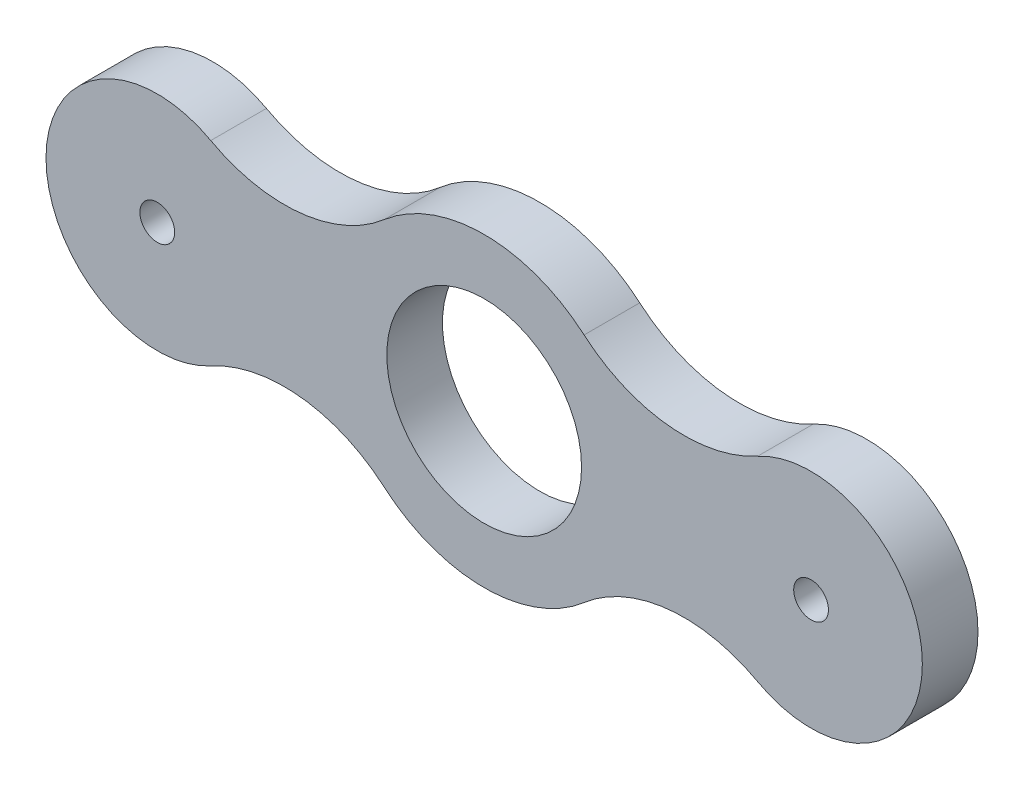
ISO-10303-21;
HEADER;
FILE_DESCRIPTION(('STEP AP214'),'2;1');
FILE_NAME('part.step','',(''),(''),'','','');
FILE_SCHEMA(('AUTOMOTIVE_DESIGN { 1 0 10303 214 1 1 1 1 }'));
ENDSEC;
DATA;
#1=APPLICATION_CONTEXT('core data for automotive mechanical design processes');
#2=APPLICATION_PROTOCOL_DEFINITION('international standard','automotive_design',2000,#1);
#3=PRODUCT_CONTEXT('',#1,'mechanical');
#4=PRODUCT('Part','Part','',(#3));
#5=PRODUCT_RELATED_PRODUCT_CATEGORY('part','',(#4));
#6=PRODUCT_DEFINITION_FORMATION('','',#4);
#7=PRODUCT_DEFINITION_CONTEXT('part definition',#1,'design');
#8=PRODUCT_DEFINITION('design','',#6,#7);
#9=PRODUCT_DEFINITION_SHAPE('','',#8);
#10=(LENGTH_UNIT() NAMED_UNIT(*) SI_UNIT(.MILLI.,.METRE.));
#11=(NAMED_UNIT(*) PLANE_ANGLE_UNIT() SI_UNIT($,.RADIAN.));
#12=(NAMED_UNIT(*) SI_UNIT($,.STERADIAN.) SOLID_ANGLE_UNIT());
#13=UNCERTAINTY_MEASURE_WITH_UNIT(LENGTH_MEASURE(1.E-05),#10,'distance_accuracy_value','');
#14=(GEOMETRIC_REPRESENTATION_CONTEXT(3) GLOBAL_UNCERTAINTY_ASSIGNED_CONTEXT((#13)) GLOBAL_UNIT_ASSIGNED_CONTEXT((#10,
#11,#12)) REPRESENTATION_CONTEXT('',''));
#15=CARTESIAN_POINT('',(0.,0.,0.));
#16=DIRECTION('',(0.,0.,1.));
#17=DIRECTION('',(1.,0.,0.));
#18=AXIS2_PLACEMENT_3D('',#15,#16,#17);
#19=CARTESIAN_POINT('',(-3.59175531914894,-4.16524833921884,2.));
#20=DIRECTION('',(0.,0.,-1.));
#21=DIRECTION('',(-1.,0.,0.));
#22=AXIS2_PLACEMENT_3D('',#19,#20,#21);
#23=PLANE('',#22);
#24=CARTESIAN_POINT('',(-7.18351063829787,-8.33049667843769,2.));
#25=DIRECTION('',(0.,0.,-1.));
#26=DIRECTION('',(-1.,0.,0.));
#27=AXIS2_PLACEMENT_3D('',#24,#25,#26);
#28=CIRCLE('',#27,5.5);
#29=CARTESIAN_POINT('',(-9.82726763717805,-3.50757754881587,2.));
#30=VERTEX_POINT('',#29);
#31=CARTESIAN_POINT('',(-3.59175531914893,-4.16524833921884,2.));
#32=VERTEX_POINT('',#31);
#33=EDGE_CURVE('E146',#30,#32,#28,.T.);
#34=ORIENTED_EDGE('',*,*,#33,.T.);
#35=CARTESIAN_POINT('',(0.,0.,2.));
#36=DIRECTION('',(0.,0.,1.));
#37=DIRECTION('',(-1.,0.,0.));
#38=AXIS2_PLACEMENT_3D('',#35,#36,#37);
#39=CIRCLE('',#38,5.5);
#40=CARTESIAN_POINT('',(3.59175531914894,-4.16524833921884,2.));
#41=VERTEX_POINT('',#40);
#42=EDGE_CURVE('E94',#32,#41,#39,.T.);
#43=ORIENTED_EDGE('',*,*,#42,.T.);
#44=CARTESIAN_POINT('',(7.18351063829787,-8.33049667843768,2.));
#45=DIRECTION('',(0.,0.,-1.));
#46=DIRECTION('',(1.,0.,0.));
#47=AXIS2_PLACEMENT_3D('',#44,#45,#46);
#48=CIRCLE('',#47,5.5);
#49=CARTESIAN_POINT('',(9.82726763717805,-3.50757754881586,2.));
#50=VERTEX_POINT('',#49);
#51=EDGE_CURVE('E161',#41,#50,#48,.T.);
#52=ORIENTED_EDGE('',*,*,#51,.T.);
#53=CARTESIAN_POINT('',(11.75,0.,2.));
#54=DIRECTION('',(0.,0.,1.));
#55=DIRECTION('',(-1.,0.,0.));
#56=AXIS2_PLACEMENT_3D('',#53,#54,#55);
#57=CIRCLE('',#56,4.);
#58=CARTESIAN_POINT('',(9.82726763717805,3.50757754881587,2.));
#59=VERTEX_POINT('',#58);
#60=EDGE_CURVE('E174',#50,#59,#57,.T.);
#61=ORIENTED_EDGE('',*,*,#60,.T.);
#62=CARTESIAN_POINT('',(7.18351063829787,8.33049667843768,2.));
#63=DIRECTION('',(0.,0.,-1.));
#64=DIRECTION('',(-1.,0.,0.));
#65=AXIS2_PLACEMENT_3D('',#62,#63,#64);
#66=CIRCLE('',#65,5.5);
#67=CARTESIAN_POINT('',(3.59175531914894,4.16524833921884,2.));
#68=VERTEX_POINT('',#67);
#69=EDGE_CURVE('E113',#59,#68,#66,.T.);
#70=ORIENTED_EDGE('',*,*,#69,.T.);
#71=CARTESIAN_POINT('',(0.,0.,2.));
#72=DIRECTION('',(0.,0.,1.));
#73=DIRECTION('',(1.,0.,0.));
#74=AXIS2_PLACEMENT_3D('',#71,#72,#73);
#75=CIRCLE('',#74,5.5);
#76=CARTESIAN_POINT('',(-3.59175531914894,4.16524833921884,2.));
#77=VERTEX_POINT('',#76);
#78=EDGE_CURVE('E107',#68,#77,#75,.T.);
#79=ORIENTED_EDGE('',*,*,#78,.T.);
#80=CARTESIAN_POINT('',(-7.18351063829787,8.33049667843768,2.));
#81=DIRECTION('',(0.,0.,-1.));
#82=DIRECTION('',(1.,0.,0.));
#83=AXIS2_PLACEMENT_3D('',#80,#81,#82);
#84=CIRCLE('',#83,5.5);
#85=CARTESIAN_POINT('',(-9.82726763717805,3.50757754881587,2.));
#86=VERTEX_POINT('',#85);
#87=EDGE_CURVE('E111',#77,#86,#84,.T.);
#88=ORIENTED_EDGE('',*,*,#87,.T.);
#89=CARTESIAN_POINT('',(-11.75,0.,2.));
#90=DIRECTION('',(0.,0.,1.));
#91=DIRECTION('',(1.,0.,0.));
#92=AXIS2_PLACEMENT_3D('',#89,#90,#91);
#93=CIRCLE('',#92,4.);
#94=EDGE_CURVE('E51',#86,#30,#93,.T.);
#95=ORIENTED_EDGE('',*,*,#94,.T.);
#96=EDGE_LOOP('',(#34,#43,#52,#61,#70,#79,#88,#95));
#97=FACE_BOUND('',#96,.T.);
#98=CARTESIAN_POINT('',(-11.75,0.,2.));
#99=DIRECTION('',(0.,0.,1.));
#100=DIRECTION('',(1.,0.,0.));
#101=AXIS2_PLACEMENT_3D('',#98,#99,#100);
#102=CIRCLE('',#101,0.625000000000001);
#103=CARTESIAN_POINT('',(-11.125,0.,2.));
#104=VERTEX_POINT('',#103);
#105=EDGE_CURVE('E135',#104,#104,#102,.T.);
#106=ORIENTED_EDGE('',*,*,#105,.F.);
#107=EDGE_LOOP('',(#106));
#108=FACE_BOUND('',#107,.T.);
#109=CARTESIAN_POINT('',(0.,0.,2.));
#110=DIRECTION('',(0.,0.,1.));
#111=DIRECTION('',(1.,0.,0.));
#112=AXIS2_PLACEMENT_3D('',#109,#110,#111);
#113=CIRCLE('',#112,3.5);
#114=CARTESIAN_POINT('',(3.5,0.,2.));
#115=VERTEX_POINT('',#114);
#116=EDGE_CURVE('E183',#115,#115,#113,.T.);
#117=ORIENTED_EDGE('',*,*,#116,.F.);
#118=EDGE_LOOP('',(#117));
#119=FACE_BOUND('',#118,.T.);
#120=CARTESIAN_POINT('',(11.75,0.,2.));
#121=DIRECTION('',(0.,0.,1.));
#122=DIRECTION('',(-1.,0.,0.));
#123=AXIS2_PLACEMENT_3D('',#120,#121,#122);
#124=CIRCLE('',#123,0.625000000000001);
#125=CARTESIAN_POINT('',(11.125,0.,2.));
#126=VERTEX_POINT('',#125);
#127=EDGE_CURVE('E189',#126,#126,#124,.T.);
#128=ORIENTED_EDGE('',*,*,#127,.F.);
#129=EDGE_LOOP('',(#128));
#130=FACE_BOUND('',#129,.T.);
#131=ADVANCED_FACE('F34',(#97,#108,#119,#130),#23,.F.);
#132=CARTESIAN_POINT('',(-3.59175531914894,-4.16524833921884,0.));
#133=DIRECTION('',(0.,0.,-1.));
#134=DIRECTION('',(-1.,0.,0.));
#135=AXIS2_PLACEMENT_3D('',#132,#133,#134);
#136=PLANE('',#135);
#137=CARTESIAN_POINT('',(0.,0.,0.));
#138=DIRECTION('',(0.,0.,1.));
#139=DIRECTION('',(1.,0.,0.));
#140=AXIS2_PLACEMENT_3D('',#137,#138,#139);
#141=CIRCLE('',#140,3.5);
#142=CARTESIAN_POINT('',(3.5,0.,0.));
#143=VERTEX_POINT('',#142);
#144=EDGE_CURVE('E186',#143,#143,#141,.T.);
#145=ORIENTED_EDGE('',*,*,#144,.T.);
#146=EDGE_LOOP('',(#145));
#147=FACE_BOUND('',#146,.T.);
#148=CARTESIAN_POINT('',(-7.18351063829787,-8.33049667843769,0.));
#149=DIRECTION('',(0.,0.,-1.));
#150=DIRECTION('',(-1.,0.,0.));
#151=AXIS2_PLACEMENT_3D('',#148,#149,#150);
#152=CIRCLE('',#151,5.5);
#153=CARTESIAN_POINT('',(-9.82726763717805,-3.50757754881587,0.));
#154=VERTEX_POINT('',#153);
#155=CARTESIAN_POINT('',(-3.59175531914893,-4.16524833921884,0.));
#156=VERTEX_POINT('',#155);
#157=EDGE_CURVE('E131',#154,#156,#152,.T.);
#158=ORIENTED_EDGE('',*,*,#157,.F.);
#159=CARTESIAN_POINT('',(-11.75,0.,0.));
#160=DIRECTION('',(0.,0.,1.));
#161=DIRECTION('',(1.,0.,0.));
#162=AXIS2_PLACEMENT_3D('',#159,#160,#161);
#163=CIRCLE('',#162,4.);
#164=CARTESIAN_POINT('',(-9.82726763717805,3.50757754881587,0.));
#165=VERTEX_POINT('',#164);
#166=EDGE_CURVE('E86',#165,#154,#163,.T.);
#167=ORIENTED_EDGE('',*,*,#166,.F.);
#168=CARTESIAN_POINT('',(-7.18351063829787,8.33049667843768,0.));
#169=DIRECTION('',(0.,0.,-1.));
#170=DIRECTION('',(1.,0.,0.));
#171=AXIS2_PLACEMENT_3D('',#168,#169,#170);
#172=CIRCLE('',#171,5.5);
#173=CARTESIAN_POINT('',(-3.59175531914894,4.16524833921884,0.));
#174=VERTEX_POINT('',#173);
#175=EDGE_CURVE('E80',#174,#165,#172,.T.);
#176=ORIENTED_EDGE('',*,*,#175,.F.);
#177=CARTESIAN_POINT('',(0.,0.,0.));
#178=DIRECTION('',(0.,0.,1.));
#179=DIRECTION('',(1.,0.,0.));
#180=AXIS2_PLACEMENT_3D('',#177,#178,#179);
#181=CIRCLE('',#180,5.5);
#182=CARTESIAN_POINT('',(3.59175531914894,4.16524833921884,0.));
#183=VERTEX_POINT('',#182);
#184=EDGE_CURVE('E121',#183,#174,#181,.T.);
#185=ORIENTED_EDGE('',*,*,#184,.F.);
#186=CARTESIAN_POINT('',(7.18351063829787,8.33049667843768,0.));
#187=DIRECTION('',(0.,0.,-1.));
#188=DIRECTION('',(-1.,0.,0.));
#189=AXIS2_PLACEMENT_3D('',#186,#187,#188);
#190=CIRCLE('',#189,5.5);
#191=CARTESIAN_POINT('',(9.82726763717805,3.50757754881587,0.));
#192=VERTEX_POINT('',#191);
#193=EDGE_CURVE('E141',#192,#183,#190,.T.);
#194=ORIENTED_EDGE('',*,*,#193,.F.);
#195=CARTESIAN_POINT('',(11.75,0.,0.));
#196=DIRECTION('',(0.,0.,1.));
#197=DIRECTION('',(-1.,0.,0.));
#198=AXIS2_PLACEMENT_3D('',#195,#196,#197);
#199=CIRCLE('',#198,4.);
#200=CARTESIAN_POINT('',(9.82726763717805,-3.50757754881586,0.));
#201=VERTEX_POINT('',#200);
#202=EDGE_CURVE('E139',#201,#192,#199,.T.);
#203=ORIENTED_EDGE('',*,*,#202,.F.);
#204=CARTESIAN_POINT('',(7.18351063829787,-8.33049667843768,0.));
#205=DIRECTION('',(0.,0.,-1.));
#206=DIRECTION('',(1.,0.,0.));
#207=AXIS2_PLACEMENT_3D('',#204,#205,#206);
#208=CIRCLE('',#207,5.5);
#209=CARTESIAN_POINT('',(3.59175531914894,-4.16524833921884,0.));
#210=VERTEX_POINT('',#209);
#211=EDGE_CURVE('E137',#210,#201,#208,.T.);
#212=ORIENTED_EDGE('',*,*,#211,.F.);
#213=CARTESIAN_POINT('',(0.,0.,0.));
#214=DIRECTION('',(0.,0.,1.));
#215=DIRECTION('',(-1.,0.,0.));
#216=AXIS2_PLACEMENT_3D('',#213,#214,#215);
#217=CIRCLE('',#216,5.5);
#218=EDGE_CURVE('E134',#156,#210,#217,.T.);
#219=ORIENTED_EDGE('',*,*,#218,.F.);
#220=EDGE_LOOP('',(#158,#167,#176,#185,#194,#203,#212,#219));
#221=FACE_BOUND('',#220,.T.);
#222=CARTESIAN_POINT('',(-11.75,0.,0.));
#223=DIRECTION('',(0.,0.,1.));
#224=DIRECTION('',(1.,0.,0.));
#225=AXIS2_PLACEMENT_3D('',#222,#223,#224);
#226=CIRCLE('',#225,0.625000000000001);
#227=CARTESIAN_POINT('',(-11.125,0.,0.));
#228=VERTEX_POINT('',#227);
#229=EDGE_CURVE('E180',#228,#228,#226,.T.);
#230=ORIENTED_EDGE('',*,*,#229,.T.);
#231=EDGE_LOOP('',(#230));
#232=FACE_BOUND('',#231,.T.);
#233=CARTESIAN_POINT('',(11.75,0.,0.));
#234=DIRECTION('',(0.,0.,1.));
#235=DIRECTION('',(-1.,0.,0.));
#236=AXIS2_PLACEMENT_3D('',#233,#234,#235);
#237=CIRCLE('',#236,0.625000000000001);
#238=CARTESIAN_POINT('',(11.125,0.,0.));
#239=VERTEX_POINT('',#238);
#240=EDGE_CURVE('E192',#239,#239,#237,.T.);
#241=ORIENTED_EDGE('',*,*,#240,.T.);
#242=EDGE_LOOP('',(#241));
#243=FACE_BOUND('',#242,.T.);
#244=ADVANCED_FACE('F165',(#147,#221,#232,#243),#136,.T.);
#245=CARTESIAN_POINT('',(-7.18351063829787,-8.33049667843769,2.));
#246=DIRECTION('',(0.,0.,-1.));
#247=DIRECTION('',(-1.,0.,0.));
#248=AXIS2_PLACEMENT_3D('',#245,#246,#247);
#249=CYLINDRICAL_SURFACE('',#248,5.5);
#250=ORIENTED_EDGE('',*,*,#157,.T.);
#251=DIRECTION('',(0.,0.,-1.));
#252=VECTOR('',#251,1.);
#253=CARTESIAN_POINT('',(-3.59175531914893,-4.16524833921884,2.));
#254=LINE('',#253,#252);
#255=EDGE_CURVE('E11',#32,#156,#254,.T.);
#256=ORIENTED_EDGE('',*,*,#255,.F.);
#257=ORIENTED_EDGE('',*,*,#33,.F.);
#258=DIRECTION('',(0.,0.,-1.));
#259=VECTOR('',#258,1.);
#260=CARTESIAN_POINT('',(-9.82726763717805,-3.50757754881587,2.));
#261=LINE('',#260,#259);
#262=EDGE_CURVE('E127',#30,#154,#261,.T.);
#263=ORIENTED_EDGE('',*,*,#262,.T.);
#264=EDGE_LOOP('',(#250,#256,#257,#263));
#265=FACE_BOUND('',#264,.T.);
#266=ADVANCED_FACE('F36',(#265),#249,.F.);
#267=CARTESIAN_POINT('',(0.,0.,2.));
#268=DIRECTION('',(0.,0.,-1.));
#269=DIRECTION('',(-1.,0.,0.));
#270=AXIS2_PLACEMENT_3D('',#267,#268,#269);
#271=CYLINDRICAL_SURFACE('',#270,5.5);
#272=ORIENTED_EDGE('',*,*,#218,.T.);
#273=DIRECTION('',(0.,0.,-1.));
#274=VECTOR('',#273,1.);
#275=CARTESIAN_POINT('',(3.59175531914894,-4.16524833921884,2.));
#276=LINE('',#275,#274);
#277=EDGE_CURVE('E43',#41,#210,#276,.T.);
#278=ORIENTED_EDGE('',*,*,#277,.F.);
#279=ORIENTED_EDGE('',*,*,#42,.F.);
#280=ORIENTED_EDGE('',*,*,#255,.T.);
#281=EDGE_LOOP('',(#272,#278,#279,#280));
#282=FACE_BOUND('',#281,.T.);
#283=ADVANCED_FACE('F224',(#282),#271,.T.);
#284=CARTESIAN_POINT('',(7.18351063829787,-8.33049667843768,2.));
#285=DIRECTION('',(0.,0.,-1.));
#286=DIRECTION('',(-1.,0.,0.));
#287=AXIS2_PLACEMENT_3D('',#284,#285,#286);
#288=CYLINDRICAL_SURFACE('',#287,5.5);
#289=ORIENTED_EDGE('',*,*,#211,.T.);
#290=DIRECTION('',(0.,0.,-1.));
#291=VECTOR('',#290,1.);
#292=CARTESIAN_POINT('',(9.82726763717805,-3.50757754881586,2.));
#293=LINE('',#292,#291);
#294=EDGE_CURVE('E153',#50,#201,#293,.T.);
#295=ORIENTED_EDGE('',*,*,#294,.F.);
#296=ORIENTED_EDGE('',*,*,#51,.F.);
#297=ORIENTED_EDGE('',*,*,#277,.T.);
#298=EDGE_LOOP('',(#289,#295,#296,#297));
#299=FACE_BOUND('',#298,.T.);
#300=ADVANCED_FACE('F159',(#299),#288,.F.);
#301=CARTESIAN_POINT('',(11.75,0.,2.));
#302=DIRECTION('',(0.,0.,-1.));
#303=DIRECTION('',(-1.,0.,0.));
#304=AXIS2_PLACEMENT_3D('',#301,#302,#303);
#305=CYLINDRICAL_SURFACE('',#304,4.);
#306=ORIENTED_EDGE('',*,*,#202,.T.);
#307=DIRECTION('',(0.,0.,-1.));
#308=VECTOR('',#307,1.);
#309=CARTESIAN_POINT('',(9.82726763717805,3.50757754881587,2.));
#310=LINE('',#309,#308);
#311=EDGE_CURVE('E150',#59,#192,#310,.T.);
#312=ORIENTED_EDGE('',*,*,#311,.F.);
#313=ORIENTED_EDGE('',*,*,#60,.F.);
#314=ORIENTED_EDGE('',*,*,#294,.T.);
#315=EDGE_LOOP('',(#306,#312,#313,#314));
#316=FACE_BOUND('',#315,.T.);
#317=ADVANCED_FACE('F170',(#316),#305,.T.);
#318=CARTESIAN_POINT('',(7.18351063829787,8.33049667843768,2.));
#319=DIRECTION('',(0.,0.,-1.));
#320=DIRECTION('',(-1.,0.,0.));
#321=AXIS2_PLACEMENT_3D('',#318,#319,#320);
#322=CYLINDRICAL_SURFACE('',#321,5.5);
#323=ORIENTED_EDGE('',*,*,#193,.T.);
#324=DIRECTION('',(0.,0.,-1.));
#325=VECTOR('',#324,1.);
#326=CARTESIAN_POINT('',(3.59175531914894,4.16524833921884,2.));
#327=LINE('',#326,#325);
#328=EDGE_CURVE('E122',#68,#183,#327,.T.);
#329=ORIENTED_EDGE('',*,*,#328,.F.);
#330=ORIENTED_EDGE('',*,*,#69,.F.);
#331=ORIENTED_EDGE('',*,*,#311,.T.);
#332=EDGE_LOOP('',(#323,#329,#330,#331));
#333=FACE_BOUND('',#332,.T.);
#334=ADVANCED_FACE('F173',(#333),#322,.F.);
#335=CARTESIAN_POINT('',(0.,0.,2.));
#336=DIRECTION('',(0.,0.,-1.));
#337=DIRECTION('',(-1.,0.,0.));
#338=AXIS2_PLACEMENT_3D('',#335,#336,#337);
#339=CYLINDRICAL_SURFACE('',#338,5.5);
#340=ORIENTED_EDGE('',*,*,#184,.T.);
#341=DIRECTION('',(0.,0.,-1.));
#342=VECTOR('',#341,1.);
#343=CARTESIAN_POINT('',(-3.59175531914894,4.16524833921884,2.));
#344=LINE('',#343,#342);
#345=EDGE_CURVE('E118',#77,#174,#344,.T.);
#346=ORIENTED_EDGE('',*,*,#345,.F.);
#347=ORIENTED_EDGE('',*,*,#78,.F.);
#348=ORIENTED_EDGE('',*,*,#328,.T.);
#349=EDGE_LOOP('',(#340,#346,#347,#348));
#350=FACE_BOUND('',#349,.T.);
#351=ADVANCED_FACE('F119',(#350),#339,.T.);
#352=CARTESIAN_POINT('',(-7.18351063829787,8.33049667843768,2.));
#353=DIRECTION('',(0.,0.,-1.));
#354=DIRECTION('',(-1.,0.,0.));
#355=AXIS2_PLACEMENT_3D('',#352,#353,#354);
#356=CYLINDRICAL_SURFACE('',#355,5.5);
#357=ORIENTED_EDGE('',*,*,#175,.T.);
#358=DIRECTION('',(0.,0.,-1.));
#359=VECTOR('',#358,1.);
#360=CARTESIAN_POINT('',(-9.82726763717805,3.50757754881587,2.));
#361=LINE('',#360,#359);
#362=EDGE_CURVE('E123',#86,#165,#361,.T.);
#363=ORIENTED_EDGE('',*,*,#362,.F.);
#364=ORIENTED_EDGE('',*,*,#87,.F.);
#365=ORIENTED_EDGE('',*,*,#345,.T.);
#366=EDGE_LOOP('',(#357,#363,#364,#365));
#367=FACE_BOUND('',#366,.T.);
#368=ADVANCED_FACE('F125',(#367),#356,.F.);
#369=CARTESIAN_POINT('',(-11.75,0.,2.));
#370=DIRECTION('',(0.,0.,-1.));
#371=DIRECTION('',(-1.,0.,0.));
#372=AXIS2_PLACEMENT_3D('',#369,#370,#371);
#373=CYLINDRICAL_SURFACE('',#372,4.);
#374=ORIENTED_EDGE('',*,*,#166,.T.);
#375=ORIENTED_EDGE('',*,*,#262,.F.);
#376=ORIENTED_EDGE('',*,*,#94,.F.);
#377=ORIENTED_EDGE('',*,*,#362,.T.);
#378=EDGE_LOOP('',(#374,#375,#376,#377));
#379=FACE_BOUND('',#378,.T.);
#380=ADVANCED_FACE('F212',(#379),#373,.T.);
#381=CARTESIAN_POINT('',(-11.75,0.,2.));
#382=DIRECTION('',(0.,0.,-1.));
#383=DIRECTION('',(-1.,0.,0.));
#384=AXIS2_PLACEMENT_3D('',#381,#382,#383);
#385=CYLINDRICAL_SURFACE('',#384,0.625000000000001);
#386=ORIENTED_EDGE('',*,*,#105,.T.);
#387=EDGE_LOOP('',(#386));
#388=FACE_BOUND('',#387,.T.);
#389=ORIENTED_EDGE('',*,*,#229,.F.);
#390=EDGE_LOOP('',(#389));
#391=FACE_BOUND('',#390,.T.);
#392=ADVANCED_FACE('F209',(#388,#391),#385,.F.);
#393=CARTESIAN_POINT('',(0.,0.,2.));
#394=DIRECTION('',(0.,0.,-1.));
#395=DIRECTION('',(-1.,0.,0.));
#396=AXIS2_PLACEMENT_3D('',#393,#394,#395);
#397=CYLINDRICAL_SURFACE('',#396,3.5);
#398=ORIENTED_EDGE('',*,*,#116,.T.);
#399=EDGE_LOOP('',(#398));
#400=FACE_BOUND('',#399,.T.);
#401=ORIENTED_EDGE('',*,*,#144,.F.);
#402=EDGE_LOOP('',(#401));
#403=FACE_BOUND('',#402,.T.);
#404=ADVANCED_FACE('F288',(#400,#403),#397,.F.);
#405=CARTESIAN_POINT('',(11.75,0.,2.));
#406=DIRECTION('',(0.,0.,-1.));
#407=DIRECTION('',(-1.,0.,0.));
#408=AXIS2_PLACEMENT_3D('',#405,#406,#407);
#409=CYLINDRICAL_SURFACE('',#408,0.625000000000001);
#410=ORIENTED_EDGE('',*,*,#127,.T.);
#411=EDGE_LOOP('',(#410));
#412=FACE_BOUND('',#411,.T.);
#413=ORIENTED_EDGE('',*,*,#240,.F.);
#414=EDGE_LOOP('',(#413));
#415=FACE_BOUND('',#414,.T.);
#416=ADVANCED_FACE('F198',(#412,#415),#409,.F.);
#417=CLOSED_SHELL('',(#131,#244,#266,#283,#300,#317,#334,#351,#368,#380,#392,#404,#416));
#418=MANIFOLD_SOLID_BREP('B2',#417);
#419=ADVANCED_BREP_SHAPE_REPRESENTATION('',(#18,#418),#14);
#420=SHAPE_DEFINITION_REPRESENTATION(#9,#419);
ENDSEC;
END-ISO-10303-21;
